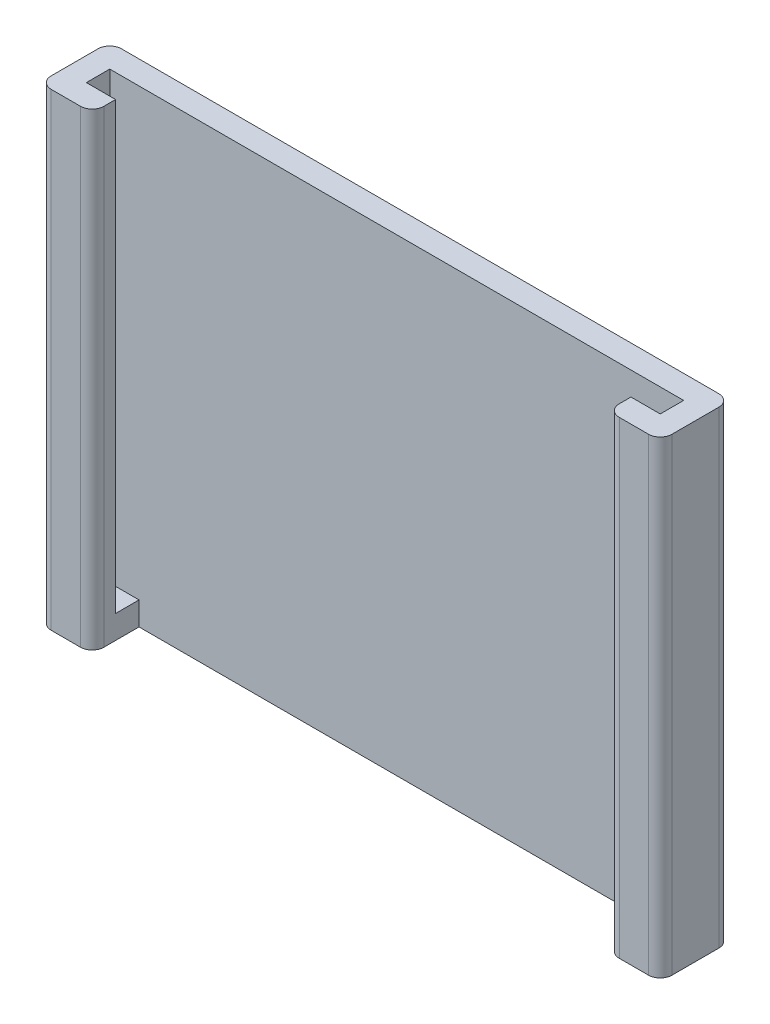
ISO-10303-21;
HEADER;
FILE_DESCRIPTION(('STEP AP214'),'2;1');
FILE_NAME('part.step','',(''),(''),'','','');
FILE_SCHEMA(('AUTOMOTIVE_DESIGN { 1 0 10303 214 1 1 1 1 }'));
ENDSEC;
DATA;
#1=APPLICATION_CONTEXT('core data for automotive mechanical design processes');
#2=APPLICATION_PROTOCOL_DEFINITION('international standard','automotive_design',2000,#1);
#3=PRODUCT_CONTEXT('',#1,'mechanical');
#4=PRODUCT('Part','Part','',(#3));
#5=PRODUCT_RELATED_PRODUCT_CATEGORY('part','',(#4));
#6=PRODUCT_DEFINITION_FORMATION('','',#4);
#7=PRODUCT_DEFINITION_CONTEXT('part definition',#1,'design');
#8=PRODUCT_DEFINITION('design','',#6,#7);
#9=PRODUCT_DEFINITION_SHAPE('','',#8);
#10=(LENGTH_UNIT() NAMED_UNIT(*) SI_UNIT(.MILLI.,.METRE.));
#11=(NAMED_UNIT(*) PLANE_ANGLE_UNIT() SI_UNIT($,.RADIAN.));
#12=(NAMED_UNIT(*) SI_UNIT($,.STERADIAN.) SOLID_ANGLE_UNIT());
#13=UNCERTAINTY_MEASURE_WITH_UNIT(LENGTH_MEASURE(1.E-05),#10,'distance_accuracy_value','');
#14=(GEOMETRIC_REPRESENTATION_CONTEXT(3) GLOBAL_UNCERTAINTY_ASSIGNED_CONTEXT((#13)) GLOBAL_UNIT_ASSIGNED_CONTEXT((#10,
#11,#12)) REPRESENTATION_CONTEXT('',''));
#15=CARTESIAN_POINT('',(0.,0.,0.));
#16=DIRECTION('',(0.,0.,1.));
#17=DIRECTION('',(1.,0.,0.));
#18=AXIS2_PLACEMENT_3D('',#15,#16,#17);
#19=CARTESIAN_POINT('',(24.5,40.,0.));
#20=DIRECTION('',(0.,0.,1.));
#21=DIRECTION('',(1.,0.,0.));
#22=AXIS2_PLACEMENT_3D('',#19,#20,#21);
#23=PLANE('',#22);
#24=DIRECTION('',(-1.,0.,0.));
#25=VECTOR('',#24,1.);
#26=CARTESIAN_POINT('',(24.5,0.,0.));
#27=LINE('',#26,#25);
#28=CARTESIAN_POINT('',(22.,0.,0.));
#29=VERTEX_POINT('',#28);
#30=CARTESIAN_POINT('',(-22.,0.,0.));
#31=VERTEX_POINT('',#30);
#32=EDGE_CURVE('E191',#29,#31,#27,.T.);
#33=ORIENTED_EDGE('',*,*,#32,.F.);
#34=DIRECTION('',(0.,-1.,0.));
#35=VECTOR('',#34,1.);
#36=CARTESIAN_POINT('',(22.,2.,0.));
#37=LINE('',#36,#35);
#38=CARTESIAN_POINT('',(22.,2.,0.));
#39=VERTEX_POINT('',#38);
#40=EDGE_CURVE('E202',#39,#29,#37,.T.);
#41=ORIENTED_EDGE('',*,*,#40,.F.);
#42=DIRECTION('',(-1.,0.,0.));
#43=VECTOR('',#42,1.);
#44=CARTESIAN_POINT('',(24.5,2.,0.));
#45=LINE('',#44,#43);
#46=CARTESIAN_POINT('',(24.5,2.,0.));
#47=VERTEX_POINT('',#46);
#48=EDGE_CURVE('E649',#47,#39,#45,.T.);
#49=ORIENTED_EDGE('',*,*,#48,.F.);
#50=DIRECTION('',(0.,-1.,0.));
#51=VECTOR('',#50,1.);
#52=CARTESIAN_POINT('',(24.5,40.,0.));
#53=LINE('',#52,#51);
#54=CARTESIAN_POINT('',(24.5,40.,0.));
#55=VERTEX_POINT('',#54);
#56=EDGE_CURVE('E243',#55,#47,#53,.T.);
#57=ORIENTED_EDGE('',*,*,#56,.F.);
#58=DIRECTION('',(-1.,0.,0.));
#59=VECTOR('',#58,1.);
#60=CARTESIAN_POINT('',(24.5,40.,0.));
#61=LINE('',#60,#59);
#62=CARTESIAN_POINT('',(-24.5,40.,0.));
#63=VERTEX_POINT('',#62);
#64=EDGE_CURVE('E197',#55,#63,#61,.T.);
#65=ORIENTED_EDGE('',*,*,#64,.T.);
#66=DIRECTION('',(0.,-1.,0.));
#67=VECTOR('',#66,1.);
#68=CARTESIAN_POINT('',(-24.5,40.,0.));
#69=LINE('',#68,#67);
#70=CARTESIAN_POINT('',(-24.5,2.,0.));
#71=VERTEX_POINT('',#70);
#72=EDGE_CURVE('E263',#63,#71,#69,.T.);
#73=ORIENTED_EDGE('',*,*,#72,.T.);
#74=DIRECTION('',(-1.,0.,0.));
#75=VECTOR('',#74,1.);
#76=CARTESIAN_POINT('',(-24.5,2.,0.));
#77=LINE('',#76,#75);
#78=CARTESIAN_POINT('',(-22.,2.,0.));
#79=VERTEX_POINT('',#78);
#80=EDGE_CURVE('E221',#79,#71,#77,.T.);
#81=ORIENTED_EDGE('',*,*,#80,.F.);
#82=DIRECTION('',(0.,-1.,0.));
#83=VECTOR('',#82,1.);
#84=CARTESIAN_POINT('',(-22.,2.,0.));
#85=LINE('',#84,#83);
#86=EDGE_CURVE('E213',#79,#31,#85,.T.);
#87=ORIENTED_EDGE('',*,*,#86,.T.);
#88=EDGE_LOOP('',(#33,#41,#49,#57,#65,#73,#81,#87));
#89=FACE_BOUND('',#88,.T.);
#90=ADVANCED_FACE('F45',(#89),#23,.T.);
#91=CARTESIAN_POINT('',(24.5,40.,0.));
#92=DIRECTION('',(1.,0.,0.));
#93=DIRECTION('',(0.,0.,-1.));
#94=AXIS2_PLACEMENT_3D('',#91,#92,#93);
#95=PLANE('',#94);
#96=DIRECTION('',(0.,0.,-1.));
#97=VECTOR('',#96,1.);
#98=CARTESIAN_POINT('',(24.5,2.,0.));
#99=LINE('',#98,#97);
#100=CARTESIAN_POINT('',(24.5,2.,2.));
#101=VERTEX_POINT('',#100);
#102=EDGE_CURVE('E401',#101,#47,#99,.T.);
#103=ORIENTED_EDGE('',*,*,#102,.F.);
#104=DIRECTION('',(0.,-1.,0.));
#105=VECTOR('',#104,1.);
#106=CARTESIAN_POINT('',(24.5,40.,1.99999999999997));
#107=LINE('',#106,#105);
#108=CARTESIAN_POINT('',(24.5,40.,1.99999999999997));
#109=VERTEX_POINT('',#108);
#110=EDGE_CURVE('E248',#109,#101,#107,.T.);
#111=ORIENTED_EDGE('',*,*,#110,.F.);
#112=DIRECTION('',(0.,0.,1.));
#113=VECTOR('',#112,1.);
#114=CARTESIAN_POINT('',(24.5,40.,0.));
#115=LINE('',#114,#113);
#116=EDGE_CURVE('E224',#55,#109,#115,.T.);
#117=ORIENTED_EDGE('',*,*,#116,.F.);
#118=ORIENTED_EDGE('',*,*,#56,.T.);
#119=EDGE_LOOP('',(#103,#111,#117,#118));
#120=FACE_BOUND('',#119,.T.);
#121=ADVANCED_FACE('F400',(#120),#95,.F.);
#122=CARTESIAN_POINT('',(22.,40.,1.99999999999998));
#123=DIRECTION('',(0.,0.,-1.));
#124=DIRECTION('',(-1.,0.,0.));
#125=AXIS2_PLACEMENT_3D('',#122,#123,#124);
#126=PLANE('',#125);
#127=ORIENTED_EDGE('',*,*,#110,.T.);
#128=DIRECTION('',(1.,0.,0.));
#129=VECTOR('',#128,1.);
#130=CARTESIAN_POINT('',(24.5,2.,2.));
#131=LINE('',#130,#129);
#132=CARTESIAN_POINT('',(22.,2.,2.));
#133=VERTEX_POINT('',#132);
#134=EDGE_CURVE('E209',#133,#101,#131,.T.);
#135=ORIENTED_EDGE('',*,*,#134,.F.);
#136=DIRECTION('',(0.,-1.,0.));
#137=VECTOR('',#136,1.);
#138=CARTESIAN_POINT('',(22.,40.,1.99999999999998));
#139=LINE('',#138,#137);
#140=CARTESIAN_POINT('',(22.,40.,1.99999999999998));
#141=VERTEX_POINT('',#140);
#142=EDGE_CURVE('E252',#141,#133,#139,.T.);
#143=ORIENTED_EDGE('',*,*,#142,.F.);
#144=DIRECTION('',(1.,0.,0.));
#145=VECTOR('',#144,1.);
#146=CARTESIAN_POINT('',(22.,40.,1.99999999999998));
#147=LINE('',#146,#145);
#148=EDGE_CURVE('E386',#141,#109,#147,.T.);
#149=ORIENTED_EDGE('',*,*,#148,.T.);
#150=EDGE_LOOP('',(#127,#135,#143,#149));
#151=FACE_BOUND('',#150,.T.);
#152=ADVANCED_FACE('F403',(#151),#126,.T.);
#153=CARTESIAN_POINT('',(22.,40.,3.99999999999998));
#154=DIRECTION('',(-1.,0.,0.));
#155=DIRECTION('',(0.,0.,1.));
#156=AXIS2_PLACEMENT_3D('',#153,#154,#155);
#157=PLANE('',#156);
#158=DIRECTION('',(0.,0.,-1.));
#159=VECTOR('',#158,1.);
#160=CARTESIAN_POINT('',(22.,0.,3.99999999999998));
#161=LINE('',#160,#159);
#162=CARTESIAN_POINT('',(22.,0.,2.99999999999997));
#163=VERTEX_POINT('',#162);
#164=EDGE_CURVE('E185',#163,#29,#161,.T.);
#165=ORIENTED_EDGE('',*,*,#164,.F.);
#166=DIRECTION('',(0.,-1.,0.));
#167=VECTOR('',#166,1.);
#168=CARTESIAN_POINT('',(22.,40.,2.99999999999997));
#169=LINE('',#168,#167);
#170=CARTESIAN_POINT('',(22.,40.,2.99999999999997));
#171=VERTEX_POINT('',#170);
#172=EDGE_CURVE('E290',#163,#171,#169,.F.);
#173=ORIENTED_EDGE('',*,*,#172,.T.);
#174=DIRECTION('',(0.,0.,-1.));
#175=VECTOR('',#174,1.);
#176=CARTESIAN_POINT('',(22.,40.,3.99999999999998));
#177=LINE('',#176,#175);
#178=EDGE_CURVE('E384',#171,#141,#177,.T.);
#179=ORIENTED_EDGE('',*,*,#178,.T.);
#180=ORIENTED_EDGE('',*,*,#142,.T.);
#181=DIRECTION('',(0.,0.,1.));
#182=VECTOR('',#181,1.);
#183=CARTESIAN_POINT('',(22.,2.,0.));
#184=LINE('',#183,#182);
#185=EDGE_CURVE('E205',#39,#133,#184,.T.);
#186=ORIENTED_EDGE('',*,*,#185,.F.);
#187=ORIENTED_EDGE('',*,*,#40,.T.);
#188=EDGE_LOOP('',(#165,#173,#179,#180,#186,#187));
#189=FACE_BOUND('',#188,.T.);
#190=ADVANCED_FACE('F203',(#189),#157,.T.);
#191=CARTESIAN_POINT('',(26.5,40.,3.99999999999997));
#192=DIRECTION('',(0.,0.,1.));
#193=DIRECTION('',(1.,0.,0.));
#194=AXIS2_PLACEMENT_3D('',#191,#192,#193);
#195=PLANE('',#194);
#196=DIRECTION('',(-1.,0.,0.));
#197=VECTOR('',#196,1.);
#198=CARTESIAN_POINT('',(26.5,40.,3.99999999999997));
#199=LINE('',#198,#197);
#200=CARTESIAN_POINT('',(25.5,40.,3.99999999999997));
#201=VERTEX_POINT('',#200);
#202=CARTESIAN_POINT('',(23.,40.,3.99999999999998));
#203=VERTEX_POINT('',#202);
#204=EDGE_CURVE('E380',#201,#203,#199,.T.);
#205=ORIENTED_EDGE('',*,*,#204,.T.);
#206=DIRECTION('',(0.,-1.,0.));
#207=VECTOR('',#206,1.);
#208=CARTESIAN_POINT('',(23.,40.,3.99999999999998));
#209=LINE('',#208,#207);
#210=CARTESIAN_POINT('',(23.,0.,3.99999999999998));
#211=VERTEX_POINT('',#210);
#212=EDGE_CURVE('E269',#203,#211,#209,.T.);
#213=ORIENTED_EDGE('',*,*,#212,.T.);
#214=DIRECTION('',(-1.,0.,0.));
#215=VECTOR('',#214,1.);
#216=CARTESIAN_POINT('',(26.5,0.,3.99999999999997));
#217=LINE('',#216,#215);
#218=CARTESIAN_POINT('',(25.5,0.,3.99999999999997));
#219=VERTEX_POINT('',#218);
#220=EDGE_CURVE('E198',#219,#211,#217,.T.);
#221=ORIENTED_EDGE('',*,*,#220,.F.);
#222=DIRECTION('',(0.,-1.,0.));
#223=VECTOR('',#222,1.);
#224=CARTESIAN_POINT('',(25.5,40.,3.99999999999997));
#225=LINE('',#224,#223);
#226=EDGE_CURVE('E247',#219,#201,#225,.F.);
#227=ORIENTED_EDGE('',*,*,#226,.T.);
#228=EDGE_LOOP('',(#205,#213,#221,#227));
#229=FACE_BOUND('',#228,.T.);
#230=ADVANCED_FACE('F414',(#229),#195,.T.);
#231=CARTESIAN_POINT('',(26.5,40.,-2.00000000000003));
#232=DIRECTION('',(1.,0.,0.));
#233=DIRECTION('',(0.,0.,-1.));
#234=AXIS2_PLACEMENT_3D('',#231,#232,#233);
#235=PLANE('',#234);
#236=DIRECTION('',(0.,0.,1.));
#237=VECTOR('',#236,1.);
#238=CARTESIAN_POINT('',(26.5,0.,-2.00000000000003));
#239=LINE('',#238,#237);
#240=CARTESIAN_POINT('',(26.5,0.,-1.00000000000003));
#241=VERTEX_POINT('',#240);
#242=CARTESIAN_POINT('',(26.5,0.,2.99999999999997));
#243=VERTEX_POINT('',#242);
#244=EDGE_CURVE('E237',#241,#243,#239,.T.);
#245=ORIENTED_EDGE('',*,*,#244,.F.);
#246=DIRECTION('',(0.,-1.,0.));
#247=VECTOR('',#246,1.);
#248=CARTESIAN_POINT('',(26.5,40.,-1.00000000000003));
#249=LINE('',#248,#247);
#250=CARTESIAN_POINT('',(26.5,40.,-1.00000000000003));
#251=VERTEX_POINT('',#250);
#252=EDGE_CURVE('E331',#241,#251,#249,.F.);
#253=ORIENTED_EDGE('',*,*,#252,.T.);
#254=DIRECTION('',(0.,0.,1.));
#255=VECTOR('',#254,1.);
#256=CARTESIAN_POINT('',(26.5,40.,-2.00000000000003));
#257=LINE('',#256,#255);
#258=CARTESIAN_POINT('',(26.5,40.,2.99999999999997));
#259=VERTEX_POINT('',#258);
#260=EDGE_CURVE('E376',#251,#259,#257,.T.);
#261=ORIENTED_EDGE('',*,*,#260,.T.);
#262=DIRECTION('',(0.,-1.,0.));
#263=VECTOR('',#262,1.);
#264=CARTESIAN_POINT('',(26.5,40.,2.99999999999997));
#265=LINE('',#264,#263);
#266=EDGE_CURVE('E327',#259,#243,#265,.T.);
#267=ORIENTED_EDGE('',*,*,#266,.T.);
#268=EDGE_LOOP('',(#245,#253,#261,#267));
#269=FACE_BOUND('',#268,.T.);
#270=ADVANCED_FACE('F422',(#269),#235,.T.);
#271=CARTESIAN_POINT('',(26.5,40.,-2.00000000000003));
#272=DIRECTION('',(0.,0.,1.));
#273=DIRECTION('',(1.,0.,0.));
#274=AXIS2_PLACEMENT_3D('',#271,#272,#273);
#275=PLANE('',#274);
#276=DIRECTION('',(-1.,0.,0.));
#277=VECTOR('',#276,1.);
#278=CARTESIAN_POINT('',(26.5,40.,-2.00000000000003));
#279=LINE('',#278,#277);
#280=CARTESIAN_POINT('',(25.5,40.,-2.00000000000003));
#281=VERTEX_POINT('',#280);
#282=CARTESIAN_POINT('',(-25.5,40.,-2.));
#283=VERTEX_POINT('',#282);
#284=EDGE_CURVE('E349',#281,#283,#279,.T.);
#285=ORIENTED_EDGE('',*,*,#284,.F.);
#286=DIRECTION('',(0.,-1.,0.));
#287=VECTOR('',#286,1.);
#288=CARTESIAN_POINT('',(25.5,0.,-2.00000000000003));
#289=LINE('',#288,#287);
#290=CARTESIAN_POINT('',(25.5,0.,-2.00000000000003));
#291=VERTEX_POINT('',#290);
#292=EDGE_CURVE('E323',#281,#291,#289,.T.);
#293=ORIENTED_EDGE('',*,*,#292,.T.);
#294=DIRECTION('',(-1.,0.,0.));
#295=VECTOR('',#294,1.);
#296=CARTESIAN_POINT('',(26.5,0.,-2.00000000000003));
#297=LINE('',#296,#295);
#298=CARTESIAN_POINT('',(-25.5,0.,-2.));
#299=VERTEX_POINT('',#298);
#300=EDGE_CURVE('E233',#291,#299,#297,.T.);
#301=ORIENTED_EDGE('',*,*,#300,.T.);
#302=DIRECTION('',(0.,-1.,0.));
#303=VECTOR('',#302,1.);
#304=CARTESIAN_POINT('',(-25.5,40.,-2.));
#305=LINE('',#304,#303);
#306=EDGE_CURVE('E320',#299,#283,#305,.F.);
#307=ORIENTED_EDGE('',*,*,#306,.T.);
#308=EDGE_LOOP('',(#285,#293,#301,#307));
#309=FACE_BOUND('',#308,.T.);
#310=ADVANCED_FACE('F432',(#309),#275,.F.);
#311=CARTESIAN_POINT('',(-26.5,40.,-2.));
#312=DIRECTION('',(1.,0.,0.));
#313=DIRECTION('',(0.,0.,-1.));
#314=AXIS2_PLACEMENT_3D('',#311,#312,#313);
#315=PLANE('',#314);
#316=DIRECTION('',(0.,0.,1.));
#317=VECTOR('',#316,1.);
#318=CARTESIAN_POINT('',(-26.5,40.,-2.));
#319=LINE('',#318,#317);
#320=CARTESIAN_POINT('',(-26.5,40.,-0.999999999999997));
#321=VERTEX_POINT('',#320);
#322=CARTESIAN_POINT('',(-26.5,40.,3.));
#323=VERTEX_POINT('',#322);
#324=EDGE_CURVE('E339',#321,#323,#319,.T.);
#325=ORIENTED_EDGE('',*,*,#324,.F.);
#326=DIRECTION('',(0.,-1.,0.));
#327=VECTOR('',#326,1.);
#328=CARTESIAN_POINT('',(-26.5,40.,-0.999999999999997));
#329=LINE('',#328,#327);
#330=CARTESIAN_POINT('',(-26.5,0.,-0.999999999999997));
#331=VERTEX_POINT('',#330);
#332=EDGE_CURVE('E11',#321,#331,#329,.T.);
#333=ORIENTED_EDGE('',*,*,#332,.T.);
#334=DIRECTION('',(0.,0.,1.));
#335=VECTOR('',#334,1.);
#336=CARTESIAN_POINT('',(-26.5,0.,-2.));
#337=LINE('',#336,#335);
#338=CARTESIAN_POINT('',(-26.5,0.,3.));
#339=VERTEX_POINT('',#338);
#340=EDGE_CURVE('E229',#331,#339,#337,.T.);
#341=ORIENTED_EDGE('',*,*,#340,.T.);
#342=DIRECTION('',(0.,-1.,0.));
#343=VECTOR('',#342,1.);
#344=CARTESIAN_POINT('',(-26.5,40.,3.));
#345=LINE('',#344,#343);
#346=EDGE_CURVE('E54',#339,#323,#345,.F.);
#347=ORIENTED_EDGE('',*,*,#346,.T.);
#348=EDGE_LOOP('',(#325,#333,#341,#347));
#349=FACE_BOUND('',#348,.T.);
#350=ADVANCED_FACE('F338',(#349),#315,.F.);
#351=CARTESIAN_POINT('',(-26.5,40.,4.));
#352=DIRECTION('',(0.,0.,-1.));
#353=DIRECTION('',(-1.,0.,0.));
#354=AXIS2_PLACEMENT_3D('',#351,#352,#353);
#355=PLANE('',#354);
#356=DIRECTION('',(1.,0.,0.));
#357=VECTOR('',#356,1.);
#358=CARTESIAN_POINT('',(-26.5,0.,4.));
#359=LINE('',#358,#357);
#360=CARTESIAN_POINT('',(-25.5,0.,4.));
#361=VERTEX_POINT('',#360);
#362=CARTESIAN_POINT('',(-23.,0.,4.));
#363=VERTEX_POINT('',#362);
#364=EDGE_CURVE('E219',#361,#363,#359,.T.);
#365=ORIENTED_EDGE('',*,*,#364,.T.);
#366=DIRECTION('',(0.,-1.,0.));
#367=VECTOR('',#366,1.);
#368=CARTESIAN_POINT('',(-23.,40.,4.));
#369=LINE('',#368,#367);
#370=CARTESIAN_POINT('',(-23.,40.,4.));
#371=VERTEX_POINT('',#370);
#372=EDGE_CURVE('E69',#363,#371,#369,.F.);
#373=ORIENTED_EDGE('',*,*,#372,.T.);
#374=DIRECTION('',(1.,0.,0.));
#375=VECTOR('',#374,1.);
#376=CARTESIAN_POINT('',(-26.5,40.,4.));
#377=LINE('',#376,#375);
#378=CARTESIAN_POINT('',(-25.5,40.,4.));
#379=VERTEX_POINT('',#378);
#380=EDGE_CURVE('E350',#379,#371,#377,.T.);
#381=ORIENTED_EDGE('',*,*,#380,.F.);
#382=DIRECTION('',(0.,-1.,0.));
#383=VECTOR('',#382,1.);
#384=CARTESIAN_POINT('',(-25.5,40.,4.));
#385=LINE('',#384,#383);
#386=EDGE_CURVE('E314',#379,#361,#385,.T.);
#387=ORIENTED_EDGE('',*,*,#386,.T.);
#388=EDGE_LOOP('',(#365,#373,#381,#387));
#389=FACE_BOUND('',#388,.T.);
#390=ADVANCED_FACE('F354',(#389),#355,.F.);
#391=CARTESIAN_POINT('',(-22.,40.,4.));
#392=DIRECTION('',(-1.,0.,0.));
#393=DIRECTION('',(0.,0.,1.));
#394=AXIS2_PLACEMENT_3D('',#391,#392,#393);
#395=PLANE('',#394);
#396=DIRECTION('',(0.,0.,-1.));
#397=VECTOR('',#396,1.);
#398=CARTESIAN_POINT('',(-22.,40.,4.));
#399=LINE('',#398,#397);
#400=CARTESIAN_POINT('',(-22.,40.,3.));
#401=VERTEX_POINT('',#400);
#402=CARTESIAN_POINT('',(-22.,40.,2.));
#403=VERTEX_POINT('',#402);
#404=EDGE_CURVE('E361',#401,#403,#399,.T.);
#405=ORIENTED_EDGE('',*,*,#404,.F.);
#406=DIRECTION('',(0.,-1.,0.));
#407=VECTOR('',#406,1.);
#408=CARTESIAN_POINT('',(-22.,40.,3.));
#409=LINE('',#408,#407);
#410=CARTESIAN_POINT('',(-22.,0.,3.));
#411=VERTEX_POINT('',#410);
#412=EDGE_CURVE('E310',#401,#411,#409,.T.);
#413=ORIENTED_EDGE('',*,*,#412,.T.);
#414=DIRECTION('',(0.,0.,-1.));
#415=VECTOR('',#414,1.);
#416=CARTESIAN_POINT('',(-22.,0.,4.));
#417=LINE('',#416,#415);
#418=EDGE_CURVE('E215',#411,#31,#417,.T.);
#419=ORIENTED_EDGE('',*,*,#418,.T.);
#420=ORIENTED_EDGE('',*,*,#86,.F.);
#421=DIRECTION('',(0.,0.,-1.));
#422=VECTOR('',#421,1.);
#423=CARTESIAN_POINT('',(-22.,2.,0.));
#424=LINE('',#423,#422);
#425=CARTESIAN_POINT('',(-22.,2.,2.));
#426=VERTEX_POINT('',#425);
#427=EDGE_CURVE('E639',#426,#79,#424,.T.);
#428=ORIENTED_EDGE('',*,*,#427,.F.);
#429=DIRECTION('',(0.,-1.,0.));
#430=VECTOR('',#429,1.);
#431=CARTESIAN_POINT('',(-22.,40.,2.));
#432=LINE('',#431,#430);
#433=EDGE_CURVE('E255',#403,#426,#432,.T.);
#434=ORIENTED_EDGE('',*,*,#433,.F.);
#435=EDGE_LOOP('',(#405,#413,#419,#420,#428,#434));
#436=FACE_BOUND('',#435,.T.);
#437=ADVANCED_FACE('F359',(#436),#395,.F.);
#438=CARTESIAN_POINT('',(-22.,40.,2.));
#439=DIRECTION('',(0.,0.,1.));
#440=DIRECTION('',(1.,0.,0.));
#441=AXIS2_PLACEMENT_3D('',#438,#439,#440);
#442=PLANE('',#441);
#443=ORIENTED_EDGE('',*,*,#433,.T.);
#444=DIRECTION('',(1.,0.,0.));
#445=VECTOR('',#444,1.);
#446=CARTESIAN_POINT('',(-24.5,2.,2.));
#447=LINE('',#446,#445);
#448=CARTESIAN_POINT('',(-24.5,2.,2.));
#449=VERTEX_POINT('',#448);
#450=EDGE_CURVE('E631',#449,#426,#447,.T.);
#451=ORIENTED_EDGE('',*,*,#450,.F.);
#452=DIRECTION('',(0.,-1.,0.));
#453=VECTOR('',#452,1.);
#454=CARTESIAN_POINT('',(-24.5,40.,2.));
#455=LINE('',#454,#453);
#456=CARTESIAN_POINT('',(-24.5,40.,2.));
#457=VERTEX_POINT('',#456);
#458=EDGE_CURVE('E259',#457,#449,#455,.T.);
#459=ORIENTED_EDGE('',*,*,#458,.F.);
#460=DIRECTION('',(-1.,0.,0.));
#461=VECTOR('',#460,1.);
#462=CARTESIAN_POINT('',(-22.,40.,2.));
#463=LINE('',#462,#461);
#464=EDGE_CURVE('E365',#403,#457,#463,.T.);
#465=ORIENTED_EDGE('',*,*,#464,.F.);
#466=EDGE_LOOP('',(#443,#451,#459,#465));
#467=FACE_BOUND('',#466,.T.);
#468=ADVANCED_FACE('F548',(#467),#442,.F.);
#469=CARTESIAN_POINT('',(-24.5,40.,0.));
#470=DIRECTION('',(1.,0.,0.));
#471=DIRECTION('',(0.,0.,-1.));
#472=AXIS2_PLACEMENT_3D('',#469,#470,#471);
#473=PLANE('',#472);
#474=DIRECTION('',(0.,0.,1.));
#475=VECTOR('',#474,1.);
#476=CARTESIAN_POINT('',(-24.5,2.,0.));
#477=LINE('',#476,#475);
#478=EDGE_CURVE('E644',#71,#449,#477,.T.);
#479=ORIENTED_EDGE('',*,*,#478,.F.);
#480=ORIENTED_EDGE('',*,*,#72,.F.);
#481=DIRECTION('',(0.,0.,1.));
#482=VECTOR('',#481,1.);
#483=CARTESIAN_POINT('',(-24.5,40.,0.));
#484=LINE('',#483,#482);
#485=EDGE_CURVE('E370',#63,#457,#484,.T.);
#486=ORIENTED_EDGE('',*,*,#485,.T.);
#487=ORIENTED_EDGE('',*,*,#458,.T.);
#488=EDGE_LOOP('',(#479,#480,#486,#487));
#489=FACE_BOUND('',#488,.T.);
#490=ADVANCED_FACE('F450',(#489),#473,.T.);
#491=CARTESIAN_POINT('',(0.,40.,0.));
#492=DIRECTION('',(0.,1.,0.));
#493=DIRECTION('',(0.,0.,1.));
#494=AXIS2_PLACEMENT_3D('',#491,#492,#493);
#495=PLANE('',#494);
#496=ORIENTED_EDGE('',*,*,#178,.F.);
#497=CARTESIAN_POINT('',(23.,40.,2.99999999999997));
#498=DIRECTION('',(0.,1.,0.));
#499=DIRECTION('',(0.,0.,1.));
#500=AXIS2_PLACEMENT_3D('',#497,#498,#499);
#501=CIRCLE('',#500,1.);
#502=EDGE_CURVE('E307',#171,#203,#501,.T.);
#503=ORIENTED_EDGE('',*,*,#502,.T.);
#504=ORIENTED_EDGE('',*,*,#204,.F.);
#505=CARTESIAN_POINT('',(25.5,40.,2.99999999999997));
#506=DIRECTION('',(0.,1.,0.));
#507=DIRECTION('',(0.,0.,1.));
#508=AXIS2_PLACEMENT_3D('',#505,#506,#507);
#509=CIRCLE('',#508,1.);
#510=EDGE_CURVE('E299',#201,#259,#509,.T.);
#511=ORIENTED_EDGE('',*,*,#510,.T.);
#512=ORIENTED_EDGE('',*,*,#260,.F.);
#513=CARTESIAN_POINT('',(25.5,40.,-1.00000000000003));
#514=DIRECTION('',(0.,1.,0.));
#515=DIRECTION('',(0.,0.,1.));
#516=AXIS2_PLACEMENT_3D('',#513,#514,#515);
#517=CIRCLE('',#516,1.);
#518=EDGE_CURVE('E302',#251,#281,#517,.T.);
#519=ORIENTED_EDGE('',*,*,#518,.T.);
#520=ORIENTED_EDGE('',*,*,#284,.T.);
#521=CARTESIAN_POINT('',(-25.5,40.,-0.999999999999997));
#522=DIRECTION('',(0.,1.,0.));
#523=DIRECTION('',(0.,0.,1.));
#524=AXIS2_PLACEMENT_3D('',#521,#522,#523);
#525=CIRCLE('',#524,1.);
#526=EDGE_CURVE('E296',#283,#321,#525,.T.);
#527=ORIENTED_EDGE('',*,*,#526,.T.);
#528=ORIENTED_EDGE('',*,*,#324,.T.);
#529=CARTESIAN_POINT('',(-25.5,40.,3.));
#530=DIRECTION('',(0.,1.,0.));
#531=DIRECTION('',(0.,0.,1.));
#532=AXIS2_PLACEMENT_3D('',#529,#530,#531);
#533=CIRCLE('',#532,1.);
#534=EDGE_CURVE('E293',#323,#379,#533,.T.);
#535=ORIENTED_EDGE('',*,*,#534,.T.);
#536=ORIENTED_EDGE('',*,*,#380,.T.);
#537=CARTESIAN_POINT('',(-23.,40.,3.));
#538=DIRECTION('',(0.,1.,0.));
#539=DIRECTION('',(0.,0.,1.));
#540=AXIS2_PLACEMENT_3D('',#537,#538,#539);
#541=CIRCLE('',#540,1.);
#542=EDGE_CURVE('E61',#371,#401,#541,.T.);
#543=ORIENTED_EDGE('',*,*,#542,.T.);
#544=ORIENTED_EDGE('',*,*,#404,.T.);
#545=ORIENTED_EDGE('',*,*,#464,.T.);
#546=ORIENTED_EDGE('',*,*,#485,.F.);
#547=ORIENTED_EDGE('',*,*,#64,.F.);
#548=ORIENTED_EDGE('',*,*,#116,.T.);
#549=ORIENTED_EDGE('',*,*,#148,.F.);
#550=EDGE_LOOP('',(#496,#503,#504,#511,#512,#519,#520,#527,#528,#535,#536,#543,#544,#545,#546,
#547,#548,#549));
#551=FACE_BOUND('',#550,.T.);
#552=ADVANCED_FACE('F345',(#551),#495,.T.);
#553=CARTESIAN_POINT('',(0.,0.,0.));
#554=DIRECTION('',(0.,1.,0.));
#555=DIRECTION('',(0.,0.,1.));
#556=AXIS2_PLACEMENT_3D('',#553,#554,#555);
#557=PLANE('',#556);
#558=ORIENTED_EDGE('',*,*,#220,.T.);
#559=CARTESIAN_POINT('',(23.,0.,2.99999999999997));
#560=DIRECTION('',(0.,1.,0.));
#561=DIRECTION('',(0.,0.,1.));
#562=AXIS2_PLACEMENT_3D('',#559,#560,#561);
#563=CIRCLE('',#562,1.);
#564=EDGE_CURVE('E193',#211,#163,#563,.F.);
#565=ORIENTED_EDGE('',*,*,#564,.T.);
#566=ORIENTED_EDGE('',*,*,#164,.T.);
#567=ORIENTED_EDGE('',*,*,#32,.T.);
#568=ORIENTED_EDGE('',*,*,#418,.F.);
#569=CARTESIAN_POINT('',(-23.,0.,3.));
#570=DIRECTION('',(0.,1.,0.));
#571=DIRECTION('',(0.,0.,1.));
#572=AXIS2_PLACEMENT_3D('',#569,#570,#571);
#573=CIRCLE('',#572,1.);
#574=EDGE_CURVE('E285',#411,#363,#573,.F.);
#575=ORIENTED_EDGE('',*,*,#574,.T.);
#576=ORIENTED_EDGE('',*,*,#364,.F.);
#577=CARTESIAN_POINT('',(-25.5,0.,3.));
#578=DIRECTION('',(0.,1.,0.));
#579=DIRECTION('',(0.,0.,1.));
#580=AXIS2_PLACEMENT_3D('',#577,#578,#579);
#581=CIRCLE('',#580,1.);
#582=EDGE_CURVE('E273',#361,#339,#581,.F.);
#583=ORIENTED_EDGE('',*,*,#582,.T.);
#584=ORIENTED_EDGE('',*,*,#340,.F.);
#585=CARTESIAN_POINT('',(-25.5,0.,-0.999999999999997));
#586=DIRECTION('',(0.,1.,0.));
#587=DIRECTION('',(0.,0.,1.));
#588=AXIS2_PLACEMENT_3D('',#585,#586,#587);
#589=CIRCLE('',#588,1.);
#590=EDGE_CURVE('E276',#331,#299,#589,.F.);
#591=ORIENTED_EDGE('',*,*,#590,.T.);
#592=ORIENTED_EDGE('',*,*,#300,.F.);
#593=CARTESIAN_POINT('',(25.5,0.,-1.00000000000003));
#594=DIRECTION('',(0.,1.,0.));
#595=DIRECTION('',(0.,0.,1.));
#596=AXIS2_PLACEMENT_3D('',#593,#594,#595);
#597=CIRCLE('',#596,1.);
#598=EDGE_CURVE('E282',#291,#241,#597,.F.);
#599=ORIENTED_EDGE('',*,*,#598,.T.);
#600=ORIENTED_EDGE('',*,*,#244,.T.);
#601=CARTESIAN_POINT('',(25.5,0.,2.99999999999997));
#602=DIRECTION('',(0.,1.,0.));
#603=DIRECTION('',(0.,0.,1.));
#604=AXIS2_PLACEMENT_3D('',#601,#602,#603);
#605=CIRCLE('',#604,1.);
#606=EDGE_CURVE('E279',#243,#219,#605,.F.);
#607=ORIENTED_EDGE('',*,*,#606,.T.);
#608=EDGE_LOOP('',(#558,#565,#566,#567,#568,#575,#576,#583,#584,#591,#592,#599,#600,#607));
#609=FACE_BOUND('',#608,.T.);
#610=ADVANCED_FACE('F188',(#609),#557,.F.);
#611=CARTESIAN_POINT('',(0.,2.,0.));
#612=DIRECTION('',(0.,1.,0.));
#613=DIRECTION('',(0.,0.,1.));
#614=AXIS2_PLACEMENT_3D('',#611,#612,#613);
#615=PLANE('',#614);
#616=ORIENTED_EDGE('',*,*,#478,.T.);
#617=ORIENTED_EDGE('',*,*,#450,.T.);
#618=ORIENTED_EDGE('',*,*,#427,.T.);
#619=ORIENTED_EDGE('',*,*,#80,.T.);
#620=EDGE_LOOP('',(#616,#617,#618,#619));
#621=FACE_BOUND('',#620,.T.);
#622=ADVANCED_FACE('F496',(#621),#615,.T.);
#623=CARTESIAN_POINT('',(0.,2.,0.));
#624=DIRECTION('',(0.,-1.,0.));
#625=DIRECTION('',(0.,0.,-1.));
#626=AXIS2_PLACEMENT_3D('',#623,#624,#625);
#627=PLANE('',#626);
#628=ORIENTED_EDGE('',*,*,#102,.T.);
#629=ORIENTED_EDGE('',*,*,#48,.T.);
#630=ORIENTED_EDGE('',*,*,#185,.T.);
#631=ORIENTED_EDGE('',*,*,#134,.T.);
#632=EDGE_LOOP('',(#628,#629,#630,#631));
#633=FACE_BOUND('',#632,.T.);
#634=ADVANCED_FACE('F454',(#633),#627,.F.);
#635=CARTESIAN_POINT('',(23.,40.,2.99999999999997));
#636=DIRECTION('',(0.,-1.,0.));
#637=DIRECTION('',(0.,0.,-1.));
#638=AXIS2_PLACEMENT_3D('',#635,#636,#637);
#639=CYLINDRICAL_SURFACE('',#638,1.);
#640=ORIENTED_EDGE('',*,*,#502,.F.);
#641=ORIENTED_EDGE('',*,*,#172,.F.);
#642=ORIENTED_EDGE('',*,*,#564,.F.);
#643=ORIENTED_EDGE('',*,*,#212,.F.);
#644=EDGE_LOOP('',(#640,#641,#642,#643));
#645=FACE_BOUND('',#644,.T.);
#646=ADVANCED_FACE('F411',(#645),#639,.T.);
#647=CARTESIAN_POINT('',(-23.,40.,3.));
#648=DIRECTION('',(0.,-1.,0.));
#649=DIRECTION('',(0.,0.,-1.));
#650=AXIS2_PLACEMENT_3D('',#647,#648,#649);
#651=CYLINDRICAL_SURFACE('',#650,1.);
#652=ORIENTED_EDGE('',*,*,#542,.F.);
#653=ORIENTED_EDGE('',*,*,#372,.F.);
#654=ORIENTED_EDGE('',*,*,#574,.F.);
#655=ORIENTED_EDGE('',*,*,#412,.F.);
#656=EDGE_LOOP('',(#652,#653,#654,#655));
#657=FACE_BOUND('',#656,.T.);
#658=ADVANCED_FACE('F357',(#657),#651,.T.);
#659=CARTESIAN_POINT('',(25.5,40.,-1.00000000000003));
#660=DIRECTION('',(0.,1.,0.));
#661=DIRECTION('',(0.,0.,1.));
#662=AXIS2_PLACEMENT_3D('',#659,#660,#661);
#663=CYLINDRICAL_SURFACE('',#662,1.);
#664=ORIENTED_EDGE('',*,*,#518,.F.);
#665=ORIENTED_EDGE('',*,*,#252,.F.);
#666=ORIENTED_EDGE('',*,*,#598,.F.);
#667=ORIENTED_EDGE('',*,*,#292,.F.);
#668=EDGE_LOOP('',(#664,#665,#666,#667));
#669=FACE_BOUND('',#668,.T.);
#670=ADVANCED_FACE('F429',(#669),#663,.T.);
#671=CARTESIAN_POINT('',(25.5,40.,2.99999999999997));
#672=DIRECTION('',(0.,-1.,0.));
#673=DIRECTION('',(0.,0.,-1.));
#674=AXIS2_PLACEMENT_3D('',#671,#672,#673);
#675=CYLINDRICAL_SURFACE('',#674,1.);
#676=ORIENTED_EDGE('',*,*,#510,.F.);
#677=ORIENTED_EDGE('',*,*,#226,.F.);
#678=ORIENTED_EDGE('',*,*,#606,.F.);
#679=ORIENTED_EDGE('',*,*,#266,.F.);
#680=EDGE_LOOP('',(#676,#677,#678,#679));
#681=FACE_BOUND('',#680,.T.);
#682=ADVANCED_FACE('F420',(#681),#675,.T.);
#683=CARTESIAN_POINT('',(-25.5,40.,-0.999999999999997));
#684=DIRECTION('',(0.,-1.,0.));
#685=DIRECTION('',(0.,0.,-1.));
#686=AXIS2_PLACEMENT_3D('',#683,#684,#685);
#687=CYLINDRICAL_SURFACE('',#686,1.);
#688=ORIENTED_EDGE('',*,*,#526,.F.);
#689=ORIENTED_EDGE('',*,*,#306,.F.);
#690=ORIENTED_EDGE('',*,*,#590,.F.);
#691=ORIENTED_EDGE('',*,*,#332,.F.);
#692=EDGE_LOOP('',(#688,#689,#690,#691));
#693=FACE_BOUND('',#692,.T.);
#694=ADVANCED_FACE('F435',(#693),#687,.T.);
#695=CARTESIAN_POINT('',(-25.5,40.,3.));
#696=DIRECTION('',(0.,-1.,0.));
#697=DIRECTION('',(0.,0.,-1.));
#698=AXIS2_PLACEMENT_3D('',#695,#696,#697);
#699=CYLINDRICAL_SURFACE('',#698,1.);
#700=ORIENTED_EDGE('',*,*,#534,.F.);
#701=ORIENTED_EDGE('',*,*,#346,.F.);
#702=ORIENTED_EDGE('',*,*,#582,.F.);
#703=ORIENTED_EDGE('',*,*,#386,.F.);
#704=EDGE_LOOP('',(#700,#701,#702,#703));
#705=FACE_BOUND('',#704,.T.);
#706=ADVANCED_FACE('F47',(#705),#699,.T.);
#707=CLOSED_SHELL('',(#90,#121,#152,#190,#230,#270,#310,#350,#390,#437,#468,#490,#552,#610,#622,
#634,#646,#658,#670,#682,#694,#706));
#708=MANIFOLD_SOLID_BREP('B2',#707);
#709=ADVANCED_BREP_SHAPE_REPRESENTATION('',(#18,#708),#14);
#710=SHAPE_DEFINITION_REPRESENTATION(#9,#709);
ENDSEC;
END-ISO-10303-21;
